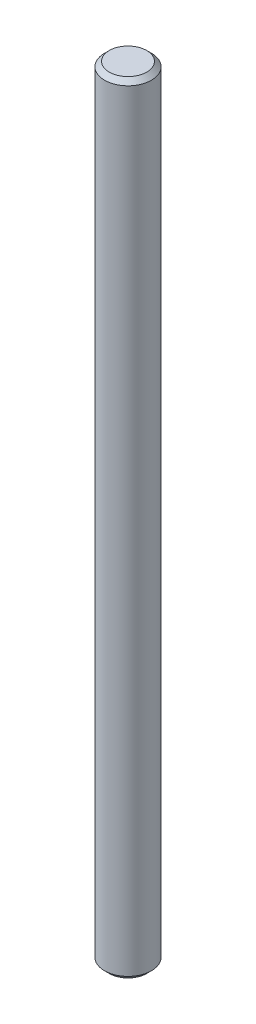
ISO-10303-21;
HEADER;
FILE_DESCRIPTION(('STEP AP214'),'2;1');
FILE_NAME('part.step','',(''),(''),'','','');
FILE_SCHEMA(('AUTOMOTIVE_DESIGN { 1 0 10303 214 1 1 1 1 }'));
ENDSEC;
DATA;
#1=APPLICATION_CONTEXT('core data for automotive mechanical design processes');
#2=APPLICATION_PROTOCOL_DEFINITION('international standard','automotive_design',2000,#1);
#3=PRODUCT_CONTEXT('',#1,'mechanical');
#4=PRODUCT('Part','Part','',(#3));
#5=PRODUCT_RELATED_PRODUCT_CATEGORY('part','',(#4));
#6=PRODUCT_DEFINITION_FORMATION('','',#4);
#7=PRODUCT_DEFINITION_CONTEXT('part definition',#1,'design');
#8=PRODUCT_DEFINITION('design','',#6,#7);
#9=PRODUCT_DEFINITION_SHAPE('','',#8);
#10=(LENGTH_UNIT() NAMED_UNIT(*) SI_UNIT(.MILLI.,.METRE.));
#11=(NAMED_UNIT(*) PLANE_ANGLE_UNIT() SI_UNIT($,.RADIAN.));
#12=(NAMED_UNIT(*) SI_UNIT($,.STERADIAN.) SOLID_ANGLE_UNIT());
#13=UNCERTAINTY_MEASURE_WITH_UNIT(LENGTH_MEASURE(1.E-05),#10,'distance_accuracy_value','');
#14=(GEOMETRIC_REPRESENTATION_CONTEXT(3) GLOBAL_UNCERTAINTY_ASSIGNED_CONTEXT((#13)) GLOBAL_UNIT_ASSIGNED_CONTEXT((#10,
#11,#12)) REPRESENTATION_CONTEXT('',''));
#15=CARTESIAN_POINT('',(0.,0.,0.));
#16=DIRECTION('',(0.,0.,1.));
#17=DIRECTION('',(1.,0.,0.));
#18=AXIS2_PLACEMENT_3D('',#15,#16,#17);
#19=CARTESIAN_POINT('',(0.,50.,0.));
#20=DIRECTION('',(0.,-1.,0.));
#21=DIRECTION('',(0.,0.,-1.));
#22=AXIS2_PLACEMENT_3D('',#19,#20,#21);
#23=CYLINDRICAL_SURFACE('',#22,1.5);
#24=CARTESIAN_POINT('',(0.,0.299999999999995,0.));
#25=DIRECTION('',(0.,1.,0.));
#26=DIRECTION('',(0.,0.,1.));
#27=AXIS2_PLACEMENT_3D('',#24,#25,#26);
#28=CIRCLE('',#27,1.5);
#29=CARTESIAN_POINT('',(0.,0.299999999999995,1.5));
#30=VERTEX_POINT('',#29);
#31=EDGE_CURVE('E41',#30,#30,#28,.T.);
#32=ORIENTED_EDGE('',*,*,#31,.T.);
#33=EDGE_LOOP('',(#32));
#34=FACE_BOUND('',#33,.T.);
#35=CARTESIAN_POINT('',(0.,49.7,0.));
#36=DIRECTION('',(0.,1.,0.));
#37=DIRECTION('',(0.,0.,1.));
#38=AXIS2_PLACEMENT_3D('',#35,#36,#37);
#39=CIRCLE('',#38,1.5);
#40=CARTESIAN_POINT('',(0.,49.7,1.5));
#41=VERTEX_POINT('',#40);
#42=EDGE_CURVE('E45',#41,#41,#39,.F.);
#43=ORIENTED_EDGE('',*,*,#42,.T.);
#44=EDGE_LOOP('',(#43));
#45=FACE_BOUND('',#44,.T.);
#46=ADVANCED_FACE('F30',(#34,#45),#23,.T.);
#47=CARTESIAN_POINT('',(0.,50.,0.));
#48=DIRECTION('',(0.,1.,0.));
#49=DIRECTION('',(0.,0.,1.));
#50=AXIS2_PLACEMENT_3D('',#47,#48,#49);
#51=PLANE('',#50);
#52=CARTESIAN_POINT('',(0.,50.,0.));
#53=DIRECTION('',(0.,1.,0.));
#54=DIRECTION('',(0.,0.,1.));
#55=AXIS2_PLACEMENT_3D('',#52,#53,#54);
#56=CIRCLE('',#55,1.2);
#57=CARTESIAN_POINT('',(0.,50.,1.2));
#58=VERTEX_POINT('',#57);
#59=EDGE_CURVE('E10',#58,#58,#56,.T.);
#60=ORIENTED_EDGE('',*,*,#59,.T.);
#61=EDGE_LOOP('',(#60));
#62=FACE_BOUND('',#61,.T.);
#63=ADVANCED_FACE('F61',(#62),#51,.T.);
#64=CARTESIAN_POINT('',(0.,0.,0.));
#65=DIRECTION('',(0.,1.,0.));
#66=DIRECTION('',(0.,0.,1.));
#67=AXIS2_PLACEMENT_3D('',#64,#65,#66);
#68=PLANE('',#67);
#69=CARTESIAN_POINT('',(0.,0.,0.));
#70=DIRECTION('',(0.,1.,0.));
#71=DIRECTION('',(0.,0.,1.));
#72=AXIS2_PLACEMENT_3D('',#69,#70,#71);
#73=CIRCLE('',#72,1.20000000000001);
#74=CARTESIAN_POINT('',(0.,0.,1.20000000000001));
#75=VERTEX_POINT('',#74);
#76=EDGE_CURVE('E37',#75,#75,#73,.F.);
#77=ORIENTED_EDGE('',*,*,#76,.T.);
#78=EDGE_LOOP('',(#77));
#79=FACE_BOUND('',#78,.T.);
#80=ADVANCED_FACE('F58',(#79),#68,.F.);
#81=CARTESIAN_POINT('',(0.,0.299999999999995,0.));
#82=DIRECTION('',(0.,1.,0.));
#83=DIRECTION('',(0.,0.,1.));
#84=AXIS2_PLACEMENT_3D('',#81,#82,#83);
#85=CONICAL_SURFACE('',#84,1.5,0.785398163397446);
#86=ORIENTED_EDGE('',*,*,#76,.F.);
#87=EDGE_LOOP('',(#86));
#88=FACE_BOUND('',#87,.T.);
#89=ORIENTED_EDGE('',*,*,#31,.F.);
#90=EDGE_LOOP('',(#89));
#91=FACE_BOUND('',#90,.T.);
#92=ADVANCED_FACE('F54',(#88,#91),#85,.T.);
#93=CARTESIAN_POINT('',(0.,50.,0.));
#94=DIRECTION('',(0.,-1.,0.));
#95=DIRECTION('',(0.,0.,-1.));
#96=AXIS2_PLACEMENT_3D('',#93,#94,#95);
#97=CONICAL_SURFACE('',#96,1.2,0.785398163397447);
#98=ORIENTED_EDGE('',*,*,#42,.F.);
#99=EDGE_LOOP('',(#98));
#100=FACE_BOUND('',#99,.T.);
#101=ORIENTED_EDGE('',*,*,#59,.F.);
#102=EDGE_LOOP('',(#101));
#103=FACE_BOUND('',#102,.T.);
#104=ADVANCED_FACE('F32',(#100,#103),#97,.T.);
#105=CLOSED_SHELL('',(#46,#63,#80,#92,#104));
#106=MANIFOLD_SOLID_BREP('B2',#105);
#107=ADVANCED_BREP_SHAPE_REPRESENTATION('',(#18,#106),#14);
#108=SHAPE_DEFINITION_REPRESENTATION(#9,#107);
ENDSEC;
END-ISO-10303-21;
